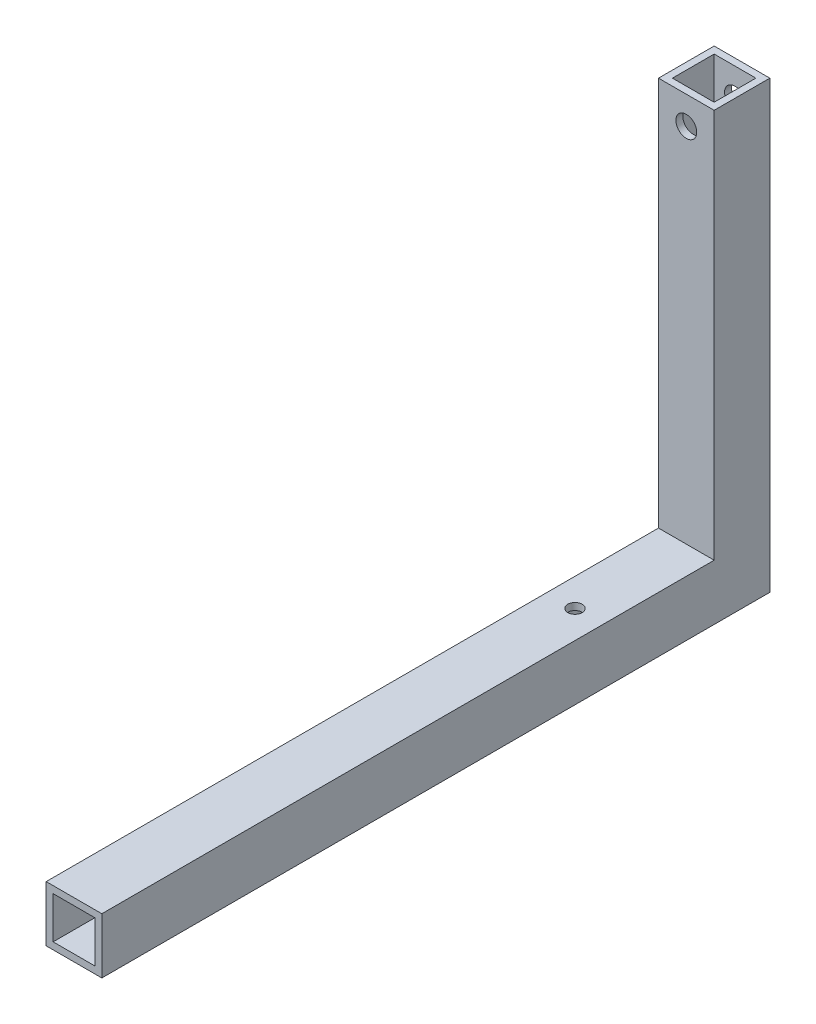
ISO-10303-21;
HEADER;
FILE_DESCRIPTION(('STEP AP214'),'2;1');
FILE_NAME('part.step','',(''),(''),'','','');
FILE_SCHEMA(('AUTOMOTIVE_DESIGN { 1 0 10303 214 1 1 1 1 }'));
ENDSEC;
DATA;
#1=APPLICATION_CONTEXT('core data for automotive mechanical design processes');
#2=APPLICATION_PROTOCOL_DEFINITION('international standard','automotive_design',2000,#1);
#3=PRODUCT_CONTEXT('',#1,'mechanical');
#4=PRODUCT('Part','Part','',(#3));
#5=PRODUCT_RELATED_PRODUCT_CATEGORY('part','',(#4));
#6=PRODUCT_DEFINITION_FORMATION('','',#4);
#7=PRODUCT_DEFINITION_CONTEXT('part definition',#1,'design');
#8=PRODUCT_DEFINITION('design','',#6,#7);
#9=PRODUCT_DEFINITION_SHAPE('','',#8);
#10=(LENGTH_UNIT() NAMED_UNIT(*) SI_UNIT(.MILLI.,.METRE.));
#11=(NAMED_UNIT(*) PLANE_ANGLE_UNIT() SI_UNIT($,.RADIAN.));
#12=(NAMED_UNIT(*) SI_UNIT($,.STERADIAN.) SOLID_ANGLE_UNIT());
#13=UNCERTAINTY_MEASURE_WITH_UNIT(LENGTH_MEASURE(1.E-05),#10,'distance_accuracy_value','');
#14=(GEOMETRIC_REPRESENTATION_CONTEXT(3) GLOBAL_UNCERTAINTY_ASSIGNED_CONTEXT((#13)) GLOBAL_UNIT_ASSIGNED_CONTEXT((#10,
#11,#12)) REPRESENTATION_CONTEXT('',''));
#15=CARTESIAN_POINT('',(0.,0.,0.));
#16=DIRECTION('',(0.,0.,1.));
#17=DIRECTION('',(1.,0.,0.));
#18=AXIS2_PLACEMENT_3D('',#15,#16,#17);
#19=CARTESIAN_POINT('',(0.,0.,304.8));
#20=DIRECTION('',(0.,0.,1.));
#21=DIRECTION('',(1.,0.,0.));
#22=AXIS2_PLACEMENT_3D('',#19,#20,#21);
#23=PLANE('',#22);
#24=DIRECTION('',(0.,-1.,0.));
#25=VECTOR('',#24,1.);
#26=CARTESIAN_POINT('',(-12.7,-12.7,304.8));
#27=LINE('',#26,#25);
#28=CARTESIAN_POINT('',(-12.7,12.7,304.8));
#29=VERTEX_POINT('',#28);
#30=CARTESIAN_POINT('',(-12.7,-12.7,304.8));
#31=VERTEX_POINT('',#30);
#32=EDGE_CURVE('E262',#29,#31,#27,.T.);
#33=ORIENTED_EDGE('',*,*,#32,.T.);
#34=DIRECTION('',(1.,0.,0.));
#35=VECTOR('',#34,1.);
#36=CARTESIAN_POINT('',(12.7,-12.7,304.8));
#37=LINE('',#36,#35);
#38=CARTESIAN_POINT('',(12.7,-12.7,304.8));
#39=VERTEX_POINT('',#38);
#40=EDGE_CURVE('E266',#31,#39,#37,.T.);
#41=ORIENTED_EDGE('',*,*,#40,.T.);
#42=DIRECTION('',(0.,1.,0.));
#43=VECTOR('',#42,1.);
#44=CARTESIAN_POINT('',(12.7,-12.7,304.8));
#45=LINE('',#44,#43);
#46=CARTESIAN_POINT('',(12.7,12.7,304.8));
#47=VERTEX_POINT('',#46);
#48=EDGE_CURVE('E269',#39,#47,#45,.T.);
#49=ORIENTED_EDGE('',*,*,#48,.T.);
#50=DIRECTION('',(-1.,0.,0.));
#51=VECTOR('',#50,1.);
#52=CARTESIAN_POINT('',(12.7,12.7,304.8));
#53=LINE('',#52,#51);
#54=EDGE_CURVE('E272',#47,#29,#53,.T.);
#55=ORIENTED_EDGE('',*,*,#54,.T.);
#56=EDGE_LOOP('',(#33,#41,#49,#55));
#57=FACE_BOUND('',#56,.T.);
#58=DIRECTION('',(-1.,0.,0.));
#59=VECTOR('',#58,1.);
#60=CARTESIAN_POINT('',(9.525,9.525,304.8));
#61=LINE('',#60,#59);
#62=CARTESIAN_POINT('',(9.525,9.525,304.8));
#63=VERTEX_POINT('',#62);
#64=CARTESIAN_POINT('',(-9.525,9.525,304.8));
#65=VERTEX_POINT('',#64);
#66=EDGE_CURVE('E239',#63,#65,#61,.T.);
#67=ORIENTED_EDGE('',*,*,#66,.F.);
#68=DIRECTION('',(0.,1.,0.));
#69=VECTOR('',#68,1.);
#70=CARTESIAN_POINT('',(9.525,-9.525,304.8));
#71=LINE('',#70,#69);
#72=CARTESIAN_POINT('',(9.525,-9.525,304.8));
#73=VERTEX_POINT('',#72);
#74=EDGE_CURVE('E236',#73,#63,#71,.T.);
#75=ORIENTED_EDGE('',*,*,#74,.F.);
#76=DIRECTION('',(1.,0.,0.));
#77=VECTOR('',#76,1.);
#78=CARTESIAN_POINT('',(9.525,-9.525,304.8));
#79=LINE('',#78,#77);
#80=CARTESIAN_POINT('',(-9.525,-9.525,304.8));
#81=VERTEX_POINT('',#80);
#82=EDGE_CURVE('E246',#81,#73,#79,.T.);
#83=ORIENTED_EDGE('',*,*,#82,.F.);
#84=DIRECTION('',(0.,-1.,0.));
#85=VECTOR('',#84,1.);
#86=CARTESIAN_POINT('',(-9.525,-9.525,304.8));
#87=LINE('',#86,#85);
#88=EDGE_CURVE('E242',#65,#81,#87,.T.);
#89=ORIENTED_EDGE('',*,*,#88,.F.);
#90=EDGE_LOOP('',(#67,#75,#83,#89));
#91=FACE_BOUND('',#90,.T.);
#92=ADVANCED_FACE('F47',(#57,#91),#23,.T.);
#93=CARTESIAN_POINT('',(-12.7,-12.7,304.8));
#94=DIRECTION('',(1.,0.,0.));
#95=DIRECTION('',(0.,0.,-1.));
#96=AXIS2_PLACEMENT_3D('',#93,#94,#95);
#97=PLANE('',#96);
#98=DIRECTION('',(0.,0.,-1.));
#99=VECTOR('',#98,1.);
#100=CARTESIAN_POINT('',(-12.7,12.7,304.8));
#101=LINE('',#100,#99);
#102=CARTESIAN_POINT('',(-12.7,12.7,25.4000000000004));
#103=VERTEX_POINT('',#102);
#104=EDGE_CURVE('E275',#29,#103,#101,.T.);
#105=ORIENTED_EDGE('',*,*,#104,.T.);
#106=DIRECTION('',(0.,-1.,0.));
#107=VECTOR('',#106,1.);
#108=CARTESIAN_POINT('',(-12.7,190.5,25.4000000000022));
#109=LINE('',#108,#107);
#110=CARTESIAN_POINT('',(-12.7,190.5,25.4000000000022));
#111=VERTEX_POINT('',#110);
#112=EDGE_CURVE('E204',#111,#103,#109,.T.);
#113=ORIENTED_EDGE('',*,*,#112,.F.);
#114=DIRECTION('',(0.,0.,1.));
#115=VECTOR('',#114,1.);
#116=CARTESIAN_POINT('',(-12.7,190.5,2.18054740930285E-12));
#117=LINE('',#116,#115);
#118=CARTESIAN_POINT('',(-12.7,190.5,2.18054740930285E-12));
#119=VERTEX_POINT('',#118);
#120=EDGE_CURVE('E191',#119,#111,#117,.T.);
#121=ORIENTED_EDGE('',*,*,#120,.F.);
#122=DIRECTION('',(0.,-1.,0.));
#123=VECTOR('',#122,1.);
#124=CARTESIAN_POINT('',(-12.7,190.5,2.18054740930285E-12));
#125=LINE('',#124,#123);
#126=CARTESIAN_POINT('',(-12.7,-12.7,0.));
#127=VERTEX_POINT('',#126);
#128=EDGE_CURVE('E208',#119,#127,#125,.T.);
#129=ORIENTED_EDGE('',*,*,#128,.T.);
#130=DIRECTION('',(0.,0.,-1.));
#131=VECTOR('',#130,1.);
#132=CARTESIAN_POINT('',(-12.7,-12.7,304.8));
#133=LINE('',#132,#131);
#134=EDGE_CURVE('E11',#31,#127,#133,.T.);
#135=ORIENTED_EDGE('',*,*,#134,.F.);
#136=ORIENTED_EDGE('',*,*,#32,.F.);
#137=EDGE_LOOP('',(#105,#113,#121,#129,#135,#136));
#138=FACE_BOUND('',#137,.T.);
#139=ADVANCED_FACE('F49',(#138),#97,.F.);
#140=CARTESIAN_POINT('',(12.7,-12.7,304.8));
#141=DIRECTION('',(0.,1.,0.));
#142=DIRECTION('',(-1.,0.,0.));
#143=AXIS2_PLACEMENT_3D('',#140,#141,#142);
#144=PLANE('',#143);
#145=CARTESIAN_POINT('',(0.,-12.7,76.2000000000004));
#146=DIRECTION('',(0.,1.,0.));
#147=DIRECTION('',(-1.,0.,0.));
#148=AXIS2_PLACEMENT_3D('',#145,#146,#147);
#149=CIRCLE('',#148,3.302);
#150=CARTESIAN_POINT('',(-3.302,-12.7,76.2000000000004));
#151=VERTEX_POINT('',#150);
#152=EDGE_CURVE('E225',#151,#151,#149,.T.);
#153=ORIENTED_EDGE('',*,*,#152,.T.);
#154=EDGE_LOOP('',(#153));
#155=FACE_BOUND('',#154,.T.);
#156=DIRECTION('',(-1.,0.,0.));
#157=VECTOR('',#156,1.);
#158=CARTESIAN_POINT('',(-12.7,-12.7,0.));
#159=LINE('',#158,#157);
#160=CARTESIAN_POINT('',(12.7,-12.7,0.));
#161=VERTEX_POINT('',#160);
#162=EDGE_CURVE('E159',#161,#127,#159,.T.);
#163=ORIENTED_EDGE('',*,*,#162,.F.);
#164=DIRECTION('',(0.,0.,-1.));
#165=VECTOR('',#164,1.);
#166=CARTESIAN_POINT('',(12.7,-12.7,304.8));
#167=LINE('',#166,#165);
#168=EDGE_CURVE('E57',#39,#161,#167,.T.);
#169=ORIENTED_EDGE('',*,*,#168,.F.);
#170=ORIENTED_EDGE('',*,*,#40,.F.);
#171=ORIENTED_EDGE('',*,*,#134,.T.);
#172=EDGE_LOOP('',(#163,#169,#170,#171));
#173=FACE_BOUND('',#172,.T.);
#174=ADVANCED_FACE('F341',(#155,#173),#144,.F.);
#175=CARTESIAN_POINT('',(12.7,-12.7,304.8));
#176=DIRECTION('',(-1.,0.,0.));
#177=DIRECTION('',(0.,0.,1.));
#178=AXIS2_PLACEMENT_3D('',#175,#176,#177);
#179=PLANE('',#178);
#180=ORIENTED_EDGE('',*,*,#168,.T.);
#181=DIRECTION('',(0.,-1.,0.));
#182=VECTOR('',#181,1.);
#183=CARTESIAN_POINT('',(12.7,190.5,2.18054740930285E-12));
#184=LINE('',#183,#182);
#185=CARTESIAN_POINT('',(12.7,190.5,2.18054740930285E-12));
#186=VERTEX_POINT('',#185);
#187=EDGE_CURVE('E212',#186,#161,#184,.T.);
#188=ORIENTED_EDGE('',*,*,#187,.F.);
#189=DIRECTION('',(0.,0.,-1.));
#190=VECTOR('',#189,1.);
#191=CARTESIAN_POINT('',(12.7,190.5,2.18054740930285E-12));
#192=LINE('',#191,#190);
#193=CARTESIAN_POINT('',(12.7,190.5,25.4000000000022));
#194=VERTEX_POINT('',#193);
#195=EDGE_CURVE('E184',#194,#186,#192,.T.);
#196=ORIENTED_EDGE('',*,*,#195,.F.);
#197=DIRECTION('',(0.,-1.,0.));
#198=VECTOR('',#197,1.);
#199=CARTESIAN_POINT('',(12.7,190.5,25.4000000000022));
#200=LINE('',#199,#198);
#201=CARTESIAN_POINT('',(12.7,12.7,25.4000000000003));
#202=VERTEX_POINT('',#201);
#203=EDGE_CURVE('E197',#194,#202,#200,.T.);
#204=ORIENTED_EDGE('',*,*,#203,.T.);
#205=DIRECTION('',(0.,0.,-1.));
#206=VECTOR('',#205,1.);
#207=CARTESIAN_POINT('',(12.7,12.7,304.8));
#208=LINE('',#207,#206);
#209=EDGE_CURVE('E278',#47,#202,#208,.T.);
#210=ORIENTED_EDGE('',*,*,#209,.F.);
#211=ORIENTED_EDGE('',*,*,#48,.F.);
#212=EDGE_LOOP('',(#180,#188,#196,#204,#210,#211));
#213=FACE_BOUND('',#212,.T.);
#214=ADVANCED_FACE('F288',(#213),#179,.F.);
#215=CARTESIAN_POINT('',(12.7,12.7,304.8));
#216=DIRECTION('',(0.,-1.,0.));
#217=DIRECTION('',(1.,0.,0.));
#218=AXIS2_PLACEMENT_3D('',#215,#216,#217);
#219=PLANE('',#218);
#220=CARTESIAN_POINT('',(0.,12.7,76.2000000000004));
#221=DIRECTION('',(0.,1.,0.));
#222=DIRECTION('',(-1.,0.,0.));
#223=AXIS2_PLACEMENT_3D('',#220,#221,#222);
#224=CIRCLE('',#223,3.302);
#225=CARTESIAN_POINT('',(-3.302,12.7,76.2000000000004));
#226=VERTEX_POINT('',#225);
#227=EDGE_CURVE('E218',#226,#226,#224,.T.);
#228=ORIENTED_EDGE('',*,*,#227,.F.);
#229=EDGE_LOOP('',(#228));
#230=FACE_BOUND('',#229,.T.);
#231=ORIENTED_EDGE('',*,*,#209,.T.);
#232=DIRECTION('',(-1.,0.,0.));
#233=VECTOR('',#232,1.);
#234=CARTESIAN_POINT('',(12.7,12.7,25.4000000000003));
#235=LINE('',#234,#233);
#236=EDGE_CURVE('E64',#202,#103,#235,.T.);
#237=ORIENTED_EDGE('',*,*,#236,.T.);
#238=ORIENTED_EDGE('',*,*,#104,.F.);
#239=ORIENTED_EDGE('',*,*,#54,.F.);
#240=EDGE_LOOP('',(#231,#237,#238,#239));
#241=FACE_BOUND('',#240,.T.);
#242=ADVANCED_FACE('F348',(#230,#241),#219,.F.);
#243=CARTESIAN_POINT('',(9.525,-9.525,304.8));
#244=DIRECTION('',(-1.,0.,0.));
#245=DIRECTION('',(0.,0.,1.));
#246=AXIS2_PLACEMENT_3D('',#243,#244,#245);
#247=PLANE('',#246);
#248=DIRECTION('',(0.,0.,-1.));
#249=VECTOR('',#248,1.);
#250=CARTESIAN_POINT('',(9.525,9.525,304.8));
#251=LINE('',#250,#249);
#252=CARTESIAN_POINT('',(9.525,9.525,22.2250000000002));
#253=VERTEX_POINT('',#252);
#254=EDGE_CURVE('E258',#63,#253,#251,.T.);
#255=ORIENTED_EDGE('',*,*,#254,.T.);
#256=DIRECTION('',(0.,-1.,0.));
#257=VECTOR('',#256,1.);
#258=CARTESIAN_POINT('',(9.52499999999997,190.5,22.2250000000022));
#259=LINE('',#258,#257);
#260=CARTESIAN_POINT('',(9.52499999999997,190.5,22.2250000000022));
#261=VERTEX_POINT('',#260);
#262=EDGE_CURVE('E160',#261,#253,#259,.T.);
#263=ORIENTED_EDGE('',*,*,#262,.F.);
#264=DIRECTION('',(0.,0.,-1.));
#265=VECTOR('',#264,1.);
#266=CARTESIAN_POINT('',(9.52499999999997,190.5,3.17500000000218));
#267=LINE('',#266,#265);
#268=CARTESIAN_POINT('',(9.52499999999997,190.5,3.17500000000218));
#269=VERTEX_POINT('',#268);
#270=EDGE_CURVE('E165',#261,#269,#267,.T.);
#271=ORIENTED_EDGE('',*,*,#270,.T.);
#272=DIRECTION('',(0.,-1.,0.));
#273=VECTOR('',#272,1.);
#274=CARTESIAN_POINT('',(9.52499999999997,190.5,3.17500000000218));
#275=LINE('',#274,#273);
#276=CARTESIAN_POINT('',(9.52499999999997,-9.52499999999999,3.17500000000005));
#277=VERTEX_POINT('',#276);
#278=EDGE_CURVE('E178',#269,#277,#275,.T.);
#279=ORIENTED_EDGE('',*,*,#278,.T.);
#280=DIRECTION('',(0.,0.,-1.));
#281=VECTOR('',#280,1.);
#282=CARTESIAN_POINT('',(9.525,-9.525,304.8));
#283=LINE('',#282,#281);
#284=EDGE_CURVE('E249',#73,#277,#283,.T.);
#285=ORIENTED_EDGE('',*,*,#284,.F.);
#286=ORIENTED_EDGE('',*,*,#74,.T.);
#287=EDGE_LOOP('',(#255,#263,#271,#279,#285,#286));
#288=FACE_BOUND('',#287,.T.);
#289=ADVANCED_FACE('F346',(#288),#247,.T.);
#290=CARTESIAN_POINT('',(9.525,9.525,304.8));
#291=DIRECTION('',(0.,-1.,0.));
#292=DIRECTION('',(1.,0.,0.));
#293=AXIS2_PLACEMENT_3D('',#290,#291,#292);
#294=PLANE('',#293);
#295=CARTESIAN_POINT('',(0.,9.525,76.2000000000004));
#296=DIRECTION('',(0.,-1.,0.));
#297=DIRECTION('',(1.,0.,0.));
#298=AXIS2_PLACEMENT_3D('',#295,#296,#297);
#299=CIRCLE('',#298,3.302);
#300=CARTESIAN_POINT('',(-3.302,9.525,76.2000000000004));
#301=VERTEX_POINT('',#300);
#302=EDGE_CURVE('E232',#301,#301,#299,.T.);
#303=ORIENTED_EDGE('',*,*,#302,.F.);
#304=EDGE_LOOP('',(#303));
#305=FACE_BOUND('',#304,.T.);
#306=DIRECTION('',(1.,0.,0.));
#307=VECTOR('',#306,1.);
#308=CARTESIAN_POINT('',(-9.52500000000006,9.52500000000001,22.2250000000003));
#309=LINE('',#308,#307);
#310=CARTESIAN_POINT('',(-9.525,9.52500000000001,22.2250000000002));
#311=VERTEX_POINT('',#310);
#312=EDGE_CURVE('E151',#311,#253,#309,.T.);
#313=ORIENTED_EDGE('',*,*,#312,.T.);
#314=ORIENTED_EDGE('',*,*,#254,.F.);
#315=ORIENTED_EDGE('',*,*,#66,.T.);
#316=DIRECTION('',(0.,0.,-1.));
#317=VECTOR('',#316,1.);
#318=CARTESIAN_POINT('',(-9.525,9.525,304.8));
#319=LINE('',#318,#317);
#320=EDGE_CURVE('E255',#65,#311,#319,.T.);
#321=ORIENTED_EDGE('',*,*,#320,.T.);
#322=EDGE_LOOP('',(#313,#314,#315,#321));
#323=FACE_BOUND('',#322,.T.);
#324=ADVANCED_FACE('F376',(#305,#323),#294,.T.);
#325=CARTESIAN_POINT('',(-9.525,-9.525,304.8));
#326=DIRECTION('',(1.,0.,0.));
#327=DIRECTION('',(0.,0.,-1.));
#328=AXIS2_PLACEMENT_3D('',#325,#326,#327);
#329=PLANE('',#328);
#330=DIRECTION('',(0.,0.,-1.));
#331=VECTOR('',#330,1.);
#332=CARTESIAN_POINT('',(-9.525,-9.525,304.8));
#333=LINE('',#332,#331);
#334=CARTESIAN_POINT('',(-9.525,-9.525,3.17500000000015));
#335=VERTEX_POINT('',#334);
#336=EDGE_CURVE('E252',#81,#335,#333,.T.);
#337=ORIENTED_EDGE('',*,*,#336,.T.);
#338=DIRECTION('',(0.,-1.,0.));
#339=VECTOR('',#338,1.);
#340=CARTESIAN_POINT('',(-9.52500000000003,190.5,3.17500000000218));
#341=LINE('',#340,#339);
#342=CARTESIAN_POINT('',(-9.52500000000003,190.5,3.17500000000218));
#343=VERTEX_POINT('',#342);
#344=EDGE_CURVE('E145',#343,#335,#341,.T.);
#345=ORIENTED_EDGE('',*,*,#344,.F.);
#346=DIRECTION('',(0.,0.,1.));
#347=VECTOR('',#346,1.);
#348=CARTESIAN_POINT('',(-9.52500000000003,190.5,3.17500000000218));
#349=LINE('',#348,#347);
#350=CARTESIAN_POINT('',(-9.52500000000003,190.5,22.2250000000022));
#351=VERTEX_POINT('',#350);
#352=EDGE_CURVE('E139',#343,#351,#349,.T.);
#353=ORIENTED_EDGE('',*,*,#352,.T.);
#354=DIRECTION('',(0.,-1.,0.));
#355=VECTOR('',#354,1.);
#356=CARTESIAN_POINT('',(-9.52500000000003,190.5,22.2250000000022));
#357=LINE('',#356,#355);
#358=EDGE_CURVE('E143',#351,#311,#357,.T.);
#359=ORIENTED_EDGE('',*,*,#358,.T.);
#360=ORIENTED_EDGE('',*,*,#320,.F.);
#361=ORIENTED_EDGE('',*,*,#88,.T.);
#362=EDGE_LOOP('',(#337,#345,#353,#359,#360,#361));
#363=FACE_BOUND('',#362,.T.);
#364=ADVANCED_FACE('F141',(#363),#329,.T.);
#365=CARTESIAN_POINT('',(9.525,-9.525,304.8));
#366=DIRECTION('',(0.,1.,0.));
#367=DIRECTION('',(-1.,0.,0.));
#368=AXIS2_PLACEMENT_3D('',#365,#366,#367);
#369=PLANE('',#368);
#370=CARTESIAN_POINT('',(0.,-9.525,76.2000000000004));
#371=DIRECTION('',(0.,1.,0.));
#372=DIRECTION('',(-1.,0.,0.));
#373=AXIS2_PLACEMENT_3D('',#370,#371,#372);
#374=CIRCLE('',#373,3.302);
#375=CARTESIAN_POINT('',(-3.302,-9.525,76.2000000000004));
#376=VERTEX_POINT('',#375);
#377=EDGE_CURVE('E51',#376,#376,#374,.T.);
#378=ORIENTED_EDGE('',*,*,#377,.F.);
#379=EDGE_LOOP('',(#378));
#380=FACE_BOUND('',#379,.T.);
#381=DIRECTION('',(-1.,0.,0.));
#382=VECTOR('',#381,1.);
#383=CARTESIAN_POINT('',(-9.52500000000006,-9.525,3.17500000000005));
#384=LINE('',#383,#382);
#385=EDGE_CURVE('E72',#277,#335,#384,.T.);
#386=ORIENTED_EDGE('',*,*,#385,.T.);
#387=ORIENTED_EDGE('',*,*,#336,.F.);
#388=ORIENTED_EDGE('',*,*,#82,.T.);
#389=ORIENTED_EDGE('',*,*,#284,.T.);
#390=EDGE_LOOP('',(#386,#387,#388,#389));
#391=FACE_BOUND('',#390,.T.);
#392=ADVANCED_FACE('F362',(#380,#391),#369,.T.);
#393=CARTESIAN_POINT('',(0.,-12.7,76.2000000000004));
#394=DIRECTION('',(0.,1.,0.));
#395=DIRECTION('',(-1.,0.,0.));
#396=AXIS2_PLACEMENT_3D('',#393,#394,#395);
#397=CYLINDRICAL_SURFACE('',#396,3.302);
#398=CARTESIAN_POINT('',(-3.302,-9.525,76.2000000000004));
#399=CARTESIAN_POINT('',(-3.302,-9.55807291666666,76.2000000000004));
#400=CARTESIAN_POINT('',(-3.302,-9.59114583333333,76.2000000000004));
#401=CARTESIAN_POINT('',(-3.302,-9.65729166666666,76.2000000000004));
#402=CARTESIAN_POINT('',(-3.302,-9.69036458333333,76.2000000000004));
#403=CARTESIAN_POINT('',(-3.302,-9.75651041666666,76.2000000000004));
#404=CARTESIAN_POINT('',(-3.302,-9.78958333333333,76.2000000000004));
#405=CARTESIAN_POINT('',(-3.302,-9.85572916666666,76.2000000000004));
#406=CARTESIAN_POINT('',(-3.302,-9.88880208333333,76.2000000000004));
#407=CARTESIAN_POINT('',(-3.302,-9.95494791666667,76.2000000000004));
#408=CARTESIAN_POINT('',(-3.302,-9.98802083333333,76.2000000000004));
#409=CARTESIAN_POINT('',(-3.302,-10.0541666666667,76.2000000000004));
#410=CARTESIAN_POINT('',(-3.302,-10.0872395833333,76.2000000000004));
#411=CARTESIAN_POINT('',(-3.302,-10.1533854166667,76.2000000000004));
#412=CARTESIAN_POINT('',(-3.302,-10.1864583333333,76.2000000000004));
#413=CARTESIAN_POINT('',(-3.302,-10.2526041666667,76.2000000000004));
#414=CARTESIAN_POINT('',(-3.302,-10.2856770833333,76.2000000000004));
#415=CARTESIAN_POINT('',(-3.302,-10.3518229166667,76.2000000000004));
#416=CARTESIAN_POINT('',(-3.302,-10.3848958333333,76.2000000000004));
#417=CARTESIAN_POINT('',(-3.302,-10.4510416666667,76.2000000000004));
#418=CARTESIAN_POINT('',(-3.302,-10.4841145833333,76.2000000000004));
#419=CARTESIAN_POINT('',(-3.302,-10.5502604166667,76.2000000000004));
#420=CARTESIAN_POINT('',(-3.302,-10.5833333333333,76.2000000000004));
#421=CARTESIAN_POINT('',(-3.302,-10.6494791666667,76.2000000000004));
#422=CARTESIAN_POINT('',(-3.302,-10.6825520833333,76.2000000000004));
#423=CARTESIAN_POINT('',(-3.302,-10.7486979166667,76.2000000000004));
#424=CARTESIAN_POINT('',(-3.302,-10.7817708333333,76.2000000000004));
#425=CARTESIAN_POINT('',(-3.302,-10.8479166666667,76.2000000000004));
#426=CARTESIAN_POINT('',(-3.302,-10.8809895833333,76.2000000000004));
#427=CARTESIAN_POINT('',(-3.302,-10.9471354166667,76.2000000000004));
#428=CARTESIAN_POINT('',(-3.302,-10.9802083333333,76.2000000000004));
#429=CARTESIAN_POINT('',(-3.302,-11.0463541666667,76.2000000000004));
#430=CARTESIAN_POINT('',(-3.302,-11.0794270833333,76.2000000000004));
#431=CARTESIAN_POINT('',(-3.302,-11.1455729166667,76.2000000000004));
#432=CARTESIAN_POINT('',(-3.302,-11.1786458333333,76.2000000000004));
#433=CARTESIAN_POINT('',(-3.302,-11.2447916666667,76.2000000000004));
#434=CARTESIAN_POINT('',(-3.302,-11.2778645833333,76.2000000000004));
#435=CARTESIAN_POINT('',(-3.302,-11.3440104166667,76.2000000000004));
#436=CARTESIAN_POINT('',(-3.302,-11.3770833333333,76.2000000000004));
#437=CARTESIAN_POINT('',(-3.302,-11.4432291666667,76.2000000000004));
#438=CARTESIAN_POINT('',(-3.302,-11.4763020833333,76.2000000000004));
#439=CARTESIAN_POINT('',(-3.302,-11.5424479166667,76.2000000000004));
#440=CARTESIAN_POINT('',(-3.302,-11.5755208333333,76.2000000000004));
#441=CARTESIAN_POINT('',(-3.302,-11.6416666666667,76.2000000000004));
#442=CARTESIAN_POINT('',(-3.302,-11.6747395833333,76.2000000000004));
#443=CARTESIAN_POINT('',(-3.302,-11.7408854166667,76.2000000000004));
#444=CARTESIAN_POINT('',(-3.302,-11.7739583333333,76.2000000000004));
#445=CARTESIAN_POINT('',(-3.302,-11.8401041666667,76.2000000000004));
#446=CARTESIAN_POINT('',(-3.302,-11.8731770833333,76.2000000000004));
#447=CARTESIAN_POINT('',(-3.302,-11.9393229166667,76.2000000000004));
#448=CARTESIAN_POINT('',(-3.302,-11.9723958333333,76.2000000000004));
#449=CARTESIAN_POINT('',(-3.302,-12.0385416666667,76.2000000000004));
#450=CARTESIAN_POINT('',(-3.302,-12.0716145833333,76.2000000000004));
#451=CARTESIAN_POINT('',(-3.302,-12.1377604166667,76.2000000000004));
#452=CARTESIAN_POINT('',(-3.302,-12.1708333333333,76.2000000000004));
#453=CARTESIAN_POINT('',(-3.302,-12.2369791666667,76.2000000000004));
#454=CARTESIAN_POINT('',(-3.302,-12.2700520833333,76.2000000000004));
#455=CARTESIAN_POINT('',(-3.302,-12.3361979166667,76.2000000000004));
#456=CARTESIAN_POINT('',(-3.302,-12.3692708333333,76.2000000000004));
#457=CARTESIAN_POINT('',(-3.302,-12.4354166666667,76.2000000000004));
#458=CARTESIAN_POINT('',(-3.302,-12.4684895833333,76.2000000000004));
#459=CARTESIAN_POINT('',(-3.302,-12.5346354166667,76.2000000000004));
#460=CARTESIAN_POINT('',(-3.302,-12.5677083333333,76.2000000000004));
#461=CARTESIAN_POINT('',(-3.302,-12.6338541666667,76.2000000000004));
#462=CARTESIAN_POINT('',(-3.302,-12.6669270833333,76.2000000000004));
#463=CARTESIAN_POINT('',(-3.302,-12.7,76.2000000000004));
#464=B_SPLINE_CURVE_WITH_KNOTS('',3,(#398,#399,#400,#401,#402,#403,#404,#405,#406,#407,#408,
#409,#410,#411,#412,#413,#414,#415,#416,#417,#418,#419,#420,#421,#422,#423,#424,#425,#426,#427,
#428,#429,#430,#431,#432,#433,#434,#435,#436,#437,#438,#439,#440,#441,#442,#443,#444,#445,#446,
#447,#448,#449,#450,#451,#452,#453,#454,#455,#456,#457,#458,#459,#460,#461,#462,#463),
.UNSPECIFIED.,.F.,.F.,(4,2,2,2,2,2,2,2,2,2,2,2,2,2,2,2,2,2,2,2,2,2,2,2,2,2,2,2,2,2,2,2,4),(0.,
0.0992187500000012,0.198437500000001,0.297656250000002,0.396875000000001,0.496093750000001,
0.595312500000002,0.694531250000002,0.793750000000001,0.892968750000002,0.992187500000002,
1.09140625,1.190625,1.28984375,1.3890625,1.48828125,1.5875,1.68671875,1.7859375,1.88515625,
1.984375,2.08359375,2.1828125,2.28203125,2.38125,2.48046875,2.5796875,2.67890625000001,2.778125,
2.87734375,2.97656250000001,3.07578125,3.175),.UNSPECIFIED.);
#465=EDGE_CURVE('BSEAM360',#376,#151,#464,.T.);
#466=ORIENTED_EDGE('',*,*,#377,.T.);
#467=ORIENTED_EDGE('',*,*,#152,.F.);
#468=ORIENTED_EDGE('',*,*,#465,.T.);
#469=ORIENTED_EDGE('',*,*,#465,.F.);
#470=EDGE_LOOP('',(#466,#468,#467,#469));
#471=FACE_BOUND('',#470,.T.);
#472=ADVANCED_FACE('F360',(#471),#397,.F.);
#473=CARTESIAN_POINT('',(-3.302,9.525,76.2000000000004));
#474=CARTESIAN_POINT('',(-3.302,9.55807291666666,76.2000000000004));
#475=CARTESIAN_POINT('',(-3.302,9.59114583333333,76.2000000000004));
#476=CARTESIAN_POINT('',(-3.302,9.65729166666666,76.2000000000004));
#477=CARTESIAN_POINT('',(-3.302,9.69036458333333,76.2000000000004));
#478=CARTESIAN_POINT('',(-3.302,9.75651041666666,76.2000000000004));
#479=CARTESIAN_POINT('',(-3.302,9.78958333333333,76.2000000000004));
#480=CARTESIAN_POINT('',(-3.302,9.85572916666666,76.2000000000004));
#481=CARTESIAN_POINT('',(-3.302,9.88880208333333,76.2000000000004));
#482=CARTESIAN_POINT('',(-3.302,9.95494791666667,76.2000000000004));
#483=CARTESIAN_POINT('',(-3.302,9.98802083333333,76.2000000000004));
#484=CARTESIAN_POINT('',(-3.302,10.0541666666667,76.2000000000004));
#485=CARTESIAN_POINT('',(-3.302,10.0872395833333,76.2000000000004));
#486=CARTESIAN_POINT('',(-3.302,10.1533854166667,76.2000000000004));
#487=CARTESIAN_POINT('',(-3.302,10.1864583333333,76.2000000000004));
#488=CARTESIAN_POINT('',(-3.302,10.2526041666667,76.2000000000004));
#489=CARTESIAN_POINT('',(-3.302,10.2856770833333,76.2000000000004));
#490=CARTESIAN_POINT('',(-3.302,10.3518229166667,76.2000000000004));
#491=CARTESIAN_POINT('',(-3.302,10.3848958333333,76.2000000000004));
#492=CARTESIAN_POINT('',(-3.302,10.4510416666667,76.2000000000004));
#493=CARTESIAN_POINT('',(-3.302,10.4841145833333,76.2000000000004));
#494=CARTESIAN_POINT('',(-3.302,10.5502604166667,76.2000000000004));
#495=CARTESIAN_POINT('',(-3.302,10.5833333333333,76.2000000000004));
#496=CARTESIAN_POINT('',(-3.302,10.6494791666667,76.2000000000004));
#497=CARTESIAN_POINT('',(-3.302,10.6825520833333,76.2000000000004));
#498=CARTESIAN_POINT('',(-3.302,10.7486979166667,76.2000000000004));
#499=CARTESIAN_POINT('',(-3.302,10.7817708333333,76.2000000000004));
#500=CARTESIAN_POINT('',(-3.302,10.8479166666667,76.2000000000004));
#501=CARTESIAN_POINT('',(-3.302,10.8809895833333,76.2000000000004));
#502=CARTESIAN_POINT('',(-3.302,10.9471354166667,76.2000000000004));
#503=CARTESIAN_POINT('',(-3.302,10.9802083333333,76.2000000000004));
#504=CARTESIAN_POINT('',(-3.302,11.0463541666667,76.2000000000004));
#505=CARTESIAN_POINT('',(-3.302,11.0794270833333,76.2000000000004));
#506=CARTESIAN_POINT('',(-3.302,11.1455729166667,76.2000000000004));
#507=CARTESIAN_POINT('',(-3.302,11.1786458333333,76.2000000000004));
#508=CARTESIAN_POINT('',(-3.302,11.2447916666667,76.2000000000004));
#509=CARTESIAN_POINT('',(-3.302,11.2778645833333,76.2000000000004));
#510=CARTESIAN_POINT('',(-3.302,11.3440104166667,76.2000000000004));
#511=CARTESIAN_POINT('',(-3.302,11.3770833333333,76.2000000000004));
#512=CARTESIAN_POINT('',(-3.302,11.4432291666667,76.2000000000004));
#513=CARTESIAN_POINT('',(-3.302,11.4763020833333,76.2000000000004));
#514=CARTESIAN_POINT('',(-3.302,11.5424479166667,76.2000000000004));
#515=CARTESIAN_POINT('',(-3.302,11.5755208333333,76.2000000000004));
#516=CARTESIAN_POINT('',(-3.302,11.6416666666667,76.2000000000004));
#517=CARTESIAN_POINT('',(-3.302,11.6747395833333,76.2000000000004));
#518=CARTESIAN_POINT('',(-3.302,11.7408854166667,76.2000000000004));
#519=CARTESIAN_POINT('',(-3.302,11.7739583333333,76.2000000000004));
#520=CARTESIAN_POINT('',(-3.302,11.8401041666667,76.2000000000004));
#521=CARTESIAN_POINT('',(-3.302,11.8731770833333,76.2000000000004));
#522=CARTESIAN_POINT('',(-3.302,11.9393229166667,76.2000000000004));
#523=CARTESIAN_POINT('',(-3.302,11.9723958333333,76.2000000000004));
#524=CARTESIAN_POINT('',(-3.302,12.0385416666667,76.2000000000004));
#525=CARTESIAN_POINT('',(-3.302,12.0716145833333,76.2000000000004));
#526=CARTESIAN_POINT('',(-3.302,12.1377604166667,76.2000000000004));
#527=CARTESIAN_POINT('',(-3.302,12.1708333333333,76.2000000000004));
#528=CARTESIAN_POINT('',(-3.302,12.2369791666667,76.2000000000004));
#529=CARTESIAN_POINT('',(-3.302,12.2700520833333,76.2000000000004));
#530=CARTESIAN_POINT('',(-3.302,12.3361979166667,76.2000000000004));
#531=CARTESIAN_POINT('',(-3.302,12.3692708333333,76.2000000000004));
#532=CARTESIAN_POINT('',(-3.302,12.4354166666667,76.2000000000004));
#533=CARTESIAN_POINT('',(-3.302,12.4684895833333,76.2000000000004));
#534=CARTESIAN_POINT('',(-3.302,12.5346354166667,76.2000000000004));
#535=CARTESIAN_POINT('',(-3.302,12.5677083333333,76.2000000000004));
#536=CARTESIAN_POINT('',(-3.302,12.6338541666667,76.2000000000004));
#537=CARTESIAN_POINT('',(-3.302,12.6669270833333,76.2000000000004));
#538=CARTESIAN_POINT('',(-3.302,12.7,76.2000000000004));
#539=B_SPLINE_CURVE_WITH_KNOTS('',3,(#473,#474,#475,#476,#477,#478,#479,#480,#481,#482,#483,
#484,#485,#486,#487,#488,#489,#490,#491,#492,#493,#494,#495,#496,#497,#498,#499,#500,#501,#502,
#503,#504,#505,#506,#507,#508,#509,#510,#511,#512,#513,#514,#515,#516,#517,#518,#519,#520,#521,
#522,#523,#524,#525,#526,#527,#528,#529,#530,#531,#532,#533,#534,#535,#536,#537,#538),
.UNSPECIFIED.,.F.,.F.,(4,2,2,2,2,2,2,2,2,2,2,2,2,2,2,2,2,2,2,2,2,2,2,2,2,2,2,2,2,2,2,2,4),(0.,
0.0992187500000012,0.198437499999999,0.29765625,0.396875000000001,0.496093749999999,0.5953125,
0.694531250000002,0.793750000000003,0.892968750000001,0.992187500000002,1.09140625,1.190625,
1.28984375,1.3890625,1.48828125,1.5875,1.68671875,1.7859375,1.88515625,1.984375,2.08359375,
2.1828125,2.28203125,2.38125,2.48046875,2.5796875,2.67890625,2.778125,2.87734375,
2.97656250000001,3.07578125,3.175),.UNSPECIFIED.);
#540=EDGE_CURVE('BSEAM329',#301,#226,#539,.T.);
#541=ORIENTED_EDGE('',*,*,#302,.T.);
#542=ORIENTED_EDGE('',*,*,#227,.T.);
#543=ORIENTED_EDGE('',*,*,#540,.T.);
#544=ORIENTED_EDGE('',*,*,#540,.F.);
#545=EDGE_LOOP('',(#541,#543,#542,#544));
#546=FACE_BOUND('',#545,.T.);
#547=ADVANCED_FACE('F329',(#546),#397,.F.);
#548=CARTESIAN_POINT('',(0.,190.5,12.7000000000022));
#549=DIRECTION('',(0.,1.,0.));
#550=DIRECTION('',(-1.,0.,0.));
#551=AXIS2_PLACEMENT_3D('',#548,#549,#550);
#552=PLANE('',#551);
#553=ORIENTED_EDGE('',*,*,#195,.T.);
#554=DIRECTION('',(-1.,0.,0.));
#555=VECTOR('',#554,1.);
#556=CARTESIAN_POINT('',(-12.7,190.5,2.18054740930285E-12));
#557=LINE('',#556,#555);
#558=EDGE_CURVE('E188',#186,#119,#557,.T.);
#559=ORIENTED_EDGE('',*,*,#558,.T.);
#560=ORIENTED_EDGE('',*,*,#120,.T.);
#561=DIRECTION('',(1.,0.,0.));
#562=VECTOR('',#561,1.);
#563=CARTESIAN_POINT('',(-12.7,190.5,25.4000000000022));
#564=LINE('',#563,#562);
#565=EDGE_CURVE('E194',#111,#194,#564,.T.);
#566=ORIENTED_EDGE('',*,*,#565,.T.);
#567=EDGE_LOOP('',(#553,#559,#560,#566));
#568=FACE_BOUND('',#567,.T.);
#569=DIRECTION('',(1.,0.,0.));
#570=VECTOR('',#569,1.);
#571=CARTESIAN_POINT('',(-9.52500000000003,190.5,22.2250000000022));
#572=LINE('',#571,#570);
#573=EDGE_CURVE('E150',#351,#261,#572,.T.);
#574=ORIENTED_EDGE('',*,*,#573,.F.);
#575=ORIENTED_EDGE('',*,*,#352,.F.);
#576=DIRECTION('',(-1.,0.,0.));
#577=VECTOR('',#576,1.);
#578=CARTESIAN_POINT('',(-9.52500000000003,190.5,3.17500000000218));
#579=LINE('',#578,#577);
#580=EDGE_CURVE('E170',#269,#343,#579,.T.);
#581=ORIENTED_EDGE('',*,*,#580,.F.);
#582=ORIENTED_EDGE('',*,*,#270,.F.);
#583=EDGE_LOOP('',(#574,#575,#581,#582));
#584=FACE_BOUND('',#583,.T.);
#585=ADVANCED_FACE('F163',(#568,#584),#552,.T.);
#586=CARTESIAN_POINT('',(-12.7,190.5,2.18054740930285E-12));
#587=DIRECTION('',(0.,0.,1.));
#588=DIRECTION('',(1.,0.,0.));
#589=AXIS2_PLACEMENT_3D('',#586,#587,#588);
#590=PLANE('',#589);
#591=CARTESIAN_POINT('',(0.,177.8,2.04350425470068E-12));
#592=DIRECTION('',(0.,0.,-1.));
#593=DIRECTION('',(0.,-1.,0.));
#594=AXIS2_PLACEMENT_3D('',#591,#592,#593);
#595=CIRCLE('',#594,4.7625);
#596=CARTESIAN_POINT('',(0.,173.0375,1.99261267208595E-12));
#597=VERTEX_POINT('',#596);
#598=EDGE_CURVE('E314',#597,#597,#595,.T.);
#599=ORIENTED_EDGE('',*,*,#598,.F.);
#600=EDGE_LOOP('',(#599));
#601=FACE_BOUND('',#600,.T.);
#602=ORIENTED_EDGE('',*,*,#162,.T.);
#603=ORIENTED_EDGE('',*,*,#128,.F.);
#604=ORIENTED_EDGE('',*,*,#558,.F.);
#605=ORIENTED_EDGE('',*,*,#187,.T.);
#606=EDGE_LOOP('',(#602,#603,#604,#605));
#607=FACE_BOUND('',#606,.T.);
#608=ADVANCED_FACE('F293',(#601,#607),#590,.F.);
#609=CARTESIAN_POINT('',(-12.7,190.5,25.4000000000022));
#610=DIRECTION('',(0.,0.,-1.));
#611=DIRECTION('',(-1.,0.,0.));
#612=AXIS2_PLACEMENT_3D('',#609,#610,#611);
#613=PLANE('',#612);
#614=CARTESIAN_POINT('',(0.,177.8,25.4000000000021));
#615=DIRECTION('',(0.,0.,-1.));
#616=DIRECTION('',(0.,-1.,0.));
#617=AXIS2_PLACEMENT_3D('',#614,#615,#616);
#618=CIRCLE('',#617,4.76249999999999);
#619=CARTESIAN_POINT('',(0.,173.0375,25.400000000002));
#620=VERTEX_POINT('',#619);
#621=EDGE_CURVE('E224',#620,#620,#618,.T.);
#622=ORIENTED_EDGE('',*,*,#621,.T.);
#623=EDGE_LOOP('',(#622));
#624=FACE_BOUND('',#623,.T.);
#625=ORIENTED_EDGE('',*,*,#112,.T.);
#626=ORIENTED_EDGE('',*,*,#236,.F.);
#627=ORIENTED_EDGE('',*,*,#203,.F.);
#628=ORIENTED_EDGE('',*,*,#565,.F.);
#629=EDGE_LOOP('',(#625,#626,#627,#628));
#630=FACE_BOUND('',#629,.T.);
#631=ADVANCED_FACE('F301',(#624,#630),#613,.F.);
#632=CARTESIAN_POINT('',(-9.52500000000003,190.5,22.2250000000022));
#633=DIRECTION('',(0.,0.,-1.));
#634=DIRECTION('',(-1.,0.,0.));
#635=AXIS2_PLACEMENT_3D('',#632,#633,#634);
#636=PLANE('',#635);
#637=CARTESIAN_POINT('',(0.,177.8,22.225000000002));
#638=DIRECTION('',(0.,0.,-1.));
#639=DIRECTION('',(-1.,0.,0.));
#640=AXIS2_PLACEMENT_3D('',#637,#638,#639);
#641=CIRCLE('',#640,4.76249999999999);
#642=CARTESIAN_POINT('',(-4.76250000000003,177.8,22.225000000002));
#643=VERTEX_POINT('',#642);
#644=EDGE_CURVE('E223',#643,#643,#641,.T.);
#645=ORIENTED_EDGE('',*,*,#644,.F.);
#646=EDGE_LOOP('',(#645));
#647=FACE_BOUND('',#646,.T.);
#648=ORIENTED_EDGE('',*,*,#312,.F.);
#649=ORIENTED_EDGE('',*,*,#358,.F.);
#650=ORIENTED_EDGE('',*,*,#573,.T.);
#651=ORIENTED_EDGE('',*,*,#262,.T.);
#652=EDGE_LOOP('',(#648,#649,#650,#651));
#653=FACE_BOUND('',#652,.T.);
#654=ADVANCED_FACE('F155',(#647,#653),#636,.T.);
#655=CARTESIAN_POINT('',(-9.52500000000003,190.5,3.17500000000218));
#656=DIRECTION('',(0.,0.,1.));
#657=DIRECTION('',(1.,0.,0.));
#658=AXIS2_PLACEMENT_3D('',#655,#656,#657);
#659=PLANE('',#658);
#660=CARTESIAN_POINT('',(0.,177.8,3.17500000000205));
#661=DIRECTION('',(0.,0.,1.));
#662=DIRECTION('',(1.,0.,0.));
#663=AXIS2_PLACEMENT_3D('',#660,#661,#662);
#664=CIRCLE('',#663,4.76249999999999);
#665=CARTESIAN_POINT('',(4.76249999999996,177.8,3.17500000000205));
#666=VERTEX_POINT('',#665);
#667=EDGE_CURVE('E219',#666,#666,#664,.T.);
#668=ORIENTED_EDGE('',*,*,#667,.F.);
#669=EDGE_LOOP('',(#668));
#670=FACE_BOUND('',#669,.T.);
#671=ORIENTED_EDGE('',*,*,#385,.F.);
#672=ORIENTED_EDGE('',*,*,#278,.F.);
#673=ORIENTED_EDGE('',*,*,#580,.T.);
#674=ORIENTED_EDGE('',*,*,#344,.T.);
#675=EDGE_LOOP('',(#671,#672,#673,#674));
#676=FACE_BOUND('',#675,.T.);
#677=ADVANCED_FACE('F391',(#670,#676),#659,.T.);
#678=CARTESIAN_POINT('',(0.,177.8,2.04350425470068E-12));
#679=DIRECTION('',(0.,0.,-1.));
#680=DIRECTION('',(0.,-1.,0.));
#681=AXIS2_PLACEMENT_3D('',#678,#679,#680);
#682=CYLINDRICAL_SURFACE('',#681,4.76249999999999);
#683=ORIENTED_EDGE('',*,*,#667,.T.);
#684=EDGE_LOOP('',(#683));
#685=FACE_BOUND('',#684,.T.);
#686=ORIENTED_EDGE('',*,*,#598,.T.);
#687=EDGE_LOOP('',(#686));
#688=FACE_BOUND('',#687,.T.);
#689=ADVANCED_FACE('F320',(#685,#688),#682,.F.);
#690=ORIENTED_EDGE('',*,*,#644,.T.);
#691=EDGE_LOOP('',(#690));
#692=FACE_BOUND('',#691,.T.);
#693=ORIENTED_EDGE('',*,*,#621,.F.);
#694=EDGE_LOOP('',(#693));
#695=FACE_BOUND('',#694,.T.);
#696=ADVANCED_FACE('F398',(#692,#695),#682,.F.);
#697=CLOSED_SHELL('',(#92,#139,#174,#214,#242,#289,#324,#364,#392,#472,#547,#585,#608,#631,#654,
#677,#689,#696));
#698=MANIFOLD_SOLID_BREP('B2',#697);
#699=ADVANCED_BREP_SHAPE_REPRESENTATION('',(#18,#698),#14);
#700=SHAPE_DEFINITION_REPRESENTATION(#9,#699);
ENDSEC;
END-ISO-10303-21;
